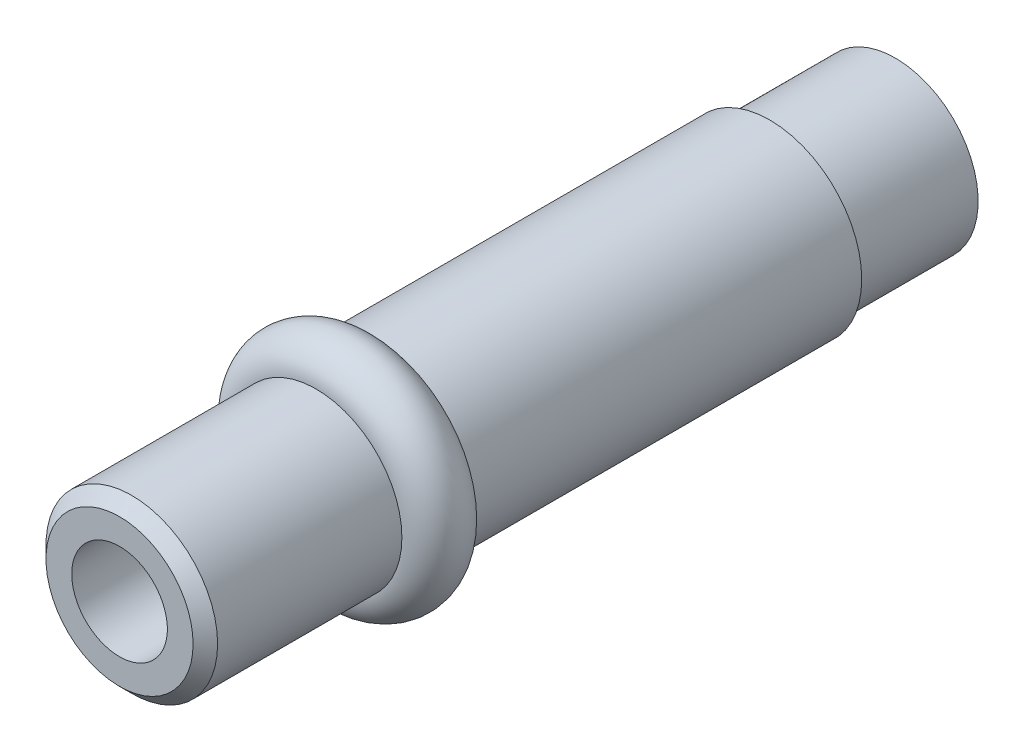
ISO-10303-21;
HEADER;
FILE_DESCRIPTION(('STEP AP214'),'2;1');
FILE_NAME('part.step','',(''),(''),'','','');
FILE_SCHEMA(('AUTOMOTIVE_DESIGN { 1 0 10303 214 1 1 1 1 }'));
ENDSEC;
DATA;
#1=APPLICATION_CONTEXT('core data for automotive mechanical design processes');
#2=APPLICATION_PROTOCOL_DEFINITION('international standard','automotive_design',2000,#1);
#3=PRODUCT_CONTEXT('',#1,'mechanical');
#4=PRODUCT('Part','Part','',(#3));
#5=PRODUCT_RELATED_PRODUCT_CATEGORY('part','',(#4));
#6=PRODUCT_DEFINITION_FORMATION('','',#4);
#7=PRODUCT_DEFINITION_CONTEXT('part definition',#1,'design');
#8=PRODUCT_DEFINITION('design','',#6,#7);
#9=PRODUCT_DEFINITION_SHAPE('','',#8);
#10=(LENGTH_UNIT() NAMED_UNIT(*) SI_UNIT(.MILLI.,.METRE.));
#11=(NAMED_UNIT(*) PLANE_ANGLE_UNIT() SI_UNIT($,.RADIAN.));
#12=(NAMED_UNIT(*) SI_UNIT($,.STERADIAN.) SOLID_ANGLE_UNIT());
#13=UNCERTAINTY_MEASURE_WITH_UNIT(LENGTH_MEASURE(1.E-05),#10,'distance_accuracy_value','');
#14=(GEOMETRIC_REPRESENTATION_CONTEXT(3) GLOBAL_UNCERTAINTY_ASSIGNED_CONTEXT((#13)) GLOBAL_UNIT_ASSIGNED_CONTEXT((#10,
#11,#12)) REPRESENTATION_CONTEXT('',''));
#15=CARTESIAN_POINT('',(0.,0.,0.));
#16=DIRECTION('',(0.,0.,1.));
#17=DIRECTION('',(1.,0.,0.));
#18=AXIS2_PLACEMENT_3D('',#15,#16,#17);
#19=CARTESIAN_POINT('',(0.,0.,32.1564));
#20=DIRECTION('',(0.,0.,-1.));
#21=DIRECTION('',(-1.,0.,0.));
#22=AXIS2_PLACEMENT_3D('',#19,#20,#21);
#23=CYLINDRICAL_SURFACE('',#22,3.81);
#24=CARTESIAN_POINT('',(0.,0.,21.452809000464));
#25=DIRECTION('',(0.,0.,1.));
#26=DIRECTION('',(1.,0.,0.));
#27=AXIS2_PLACEMENT_3D('',#24,#25,#26);
#28=CIRCLE('',#27,3.81);
#29=CARTESIAN_POINT('',(3.81,0.,21.452809000464));
#30=VERTEX_POINT('',#29);
#31=EDGE_CURVE('E63',#30,#30,#28,.T.);
#32=ORIENTED_EDGE('',*,*,#31,.F.);
#33=EDGE_LOOP('',(#32));
#34=FACE_BOUND('',#33,.T.);
#35=CARTESIAN_POINT('',(0.,0.,5.207));
#36=DIRECTION('',(0.,0.,-1.));
#37=DIRECTION('',(-1.,0.,0.));
#38=AXIS2_PLACEMENT_3D('',#35,#36,#37);
#39=CIRCLE('',#38,3.81);
#40=CARTESIAN_POINT('',(-3.81,0.,5.207));
#41=VERTEX_POINT('',#40);
#42=EDGE_CURVE('E54',#41,#41,#39,.T.);
#43=ORIENTED_EDGE('',*,*,#42,.F.);
#44=EDGE_LOOP('',(#43));
#45=FACE_BOUND('',#44,.T.);
#46=ADVANCED_FACE('F32',(#34,#45),#23,.T.);
#47=CARTESIAN_POINT('',(0.,0.,32.1564));
#48=DIRECTION('',(0.,0.,1.));
#49=DIRECTION('',(1.,0.,0.));
#50=AXIS2_PLACEMENT_3D('',#47,#48,#49);
#51=PLANE('',#50);
#52=CARTESIAN_POINT('',(0.,0.,32.1564));
#53=DIRECTION('',(0.,0.,1.));
#54=DIRECTION('',(1.,0.,0.));
#55=AXIS2_PLACEMENT_3D('',#52,#53,#54);
#56=CIRCLE('',#55,3.048);
#57=CARTESIAN_POINT('',(3.048,0.,32.1564));
#58=VERTEX_POINT('',#57);
#59=EDGE_CURVE('E40',#58,#58,#56,.T.);
#60=ORIENTED_EDGE('',*,*,#59,.T.);
#61=EDGE_LOOP('',(#60));
#62=FACE_BOUND('',#61,.T.);
#63=CARTESIAN_POINT('',(0.,0.,32.1564));
#64=DIRECTION('',(0.,0.,-1.));
#65=DIRECTION('',(-1.,0.,0.));
#66=AXIS2_PLACEMENT_3D('',#63,#64,#65);
#67=CIRCLE('',#66,1.9812);
#68=CARTESIAN_POINT('',(-1.9812,0.,32.1564));
#69=VERTEX_POINT('',#68);
#70=EDGE_CURVE('E48',#69,#69,#67,.T.);
#71=ORIENTED_EDGE('',*,*,#70,.T.);
#72=EDGE_LOOP('',(#71));
#73=FACE_BOUND('',#72,.T.);
#74=ADVANCED_FACE('F74',(#62,#73),#51,.T.);
#75=CARTESIAN_POINT('',(0.,0.,0.));
#76=DIRECTION('',(0.,0.,1.));
#77=DIRECTION('',(1.,0.,0.));
#78=AXIS2_PLACEMENT_3D('',#75,#76,#77);
#79=PLANE('',#78);
#80=CARTESIAN_POINT('',(0.,0.,0.));
#81=DIRECTION('',(0.,0.,-1.));
#82=DIRECTION('',(-1.,0.,0.));
#83=AXIS2_PLACEMENT_3D('',#80,#81,#82);
#84=CIRCLE('',#83,1.9812);
#85=CARTESIAN_POINT('',(-1.9812,0.,0.));
#86=VERTEX_POINT('',#85);
#87=EDGE_CURVE('E51',#86,#86,#84,.T.);
#88=ORIENTED_EDGE('',*,*,#87,.F.);
#89=EDGE_LOOP('',(#88));
#90=FACE_BOUND('',#89,.T.);
#91=CARTESIAN_POINT('',(0.,0.,0.));
#92=DIRECTION('',(0.,0.,-1.));
#93=DIRECTION('',(-1.,0.,0.));
#94=AXIS2_PLACEMENT_3D('',#91,#92,#93);
#95=CIRCLE('',#94,3.429);
#96=CARTESIAN_POINT('',(-3.429,0.,0.));
#97=VERTEX_POINT('',#96);
#98=EDGE_CURVE('E60',#97,#97,#95,.T.);
#99=ORIENTED_EDGE('',*,*,#98,.T.);
#100=EDGE_LOOP('',(#99));
#101=FACE_BOUND('',#100,.T.);
#102=ADVANCED_FACE('F90',(#90,#101),#79,.F.);
#103=CARTESIAN_POINT('',(0.,0.,32.1564));
#104=DIRECTION('',(0.,0.,-1.));
#105=DIRECTION('',(-1.,0.,0.));
#106=AXIS2_PLACEMENT_3D('',#103,#104,#105);
#107=CYLINDRICAL_SURFACE('',#106,1.9812);
#108=ORIENTED_EDGE('',*,*,#70,.F.);
#109=EDGE_LOOP('',(#108));
#110=FACE_BOUND('',#109,.T.);
#111=ORIENTED_EDGE('',*,*,#87,.T.);
#112=EDGE_LOOP('',(#111));
#113=FACE_BOUND('',#112,.T.);
#114=ADVANCED_FACE('F80',(#110,#113),#107,.F.);
#115=CARTESIAN_POINT('',(0.,0.,5.207));
#116=DIRECTION('',(0.,0.,-1.));
#117=DIRECTION('',(-1.,0.,0.));
#118=AXIS2_PLACEMENT_3D('',#115,#116,#117);
#119=PLANE('',#118);
#120=CARTESIAN_POINT('',(0.,0.,5.207));
#121=DIRECTION('',(0.,0.,-1.));
#122=DIRECTION('',(-1.,0.,0.));
#123=AXIS2_PLACEMENT_3D('',#120,#121,#122);
#124=CIRCLE('',#123,3.429);
#125=CARTESIAN_POINT('',(-3.429,0.,5.207));
#126=VERTEX_POINT('',#125);
#127=EDGE_CURVE('E59',#126,#126,#124,.T.);
#128=ORIENTED_EDGE('',*,*,#127,.F.);
#129=EDGE_LOOP('',(#128));
#130=FACE_BOUND('',#129,.T.);
#131=ORIENTED_EDGE('',*,*,#42,.T.);
#132=EDGE_LOOP('',(#131));
#133=FACE_BOUND('',#132,.T.);
#134=ADVANCED_FACE('F77',(#130,#133),#119,.T.);
#135=CARTESIAN_POINT('',(0.,0.,5.207));
#136=DIRECTION('',(0.,0.,-1.));
#137=DIRECTION('',(-1.,0.,0.));
#138=AXIS2_PLACEMENT_3D('',#135,#136,#137);
#139=CYLINDRICAL_SURFACE('',#138,3.429);
#140=ORIENTED_EDGE('',*,*,#127,.T.);
#141=EDGE_LOOP('',(#140));
#142=FACE_BOUND('',#141,.T.);
#143=ORIENTED_EDGE('',*,*,#98,.F.);
#144=EDGE_LOOP('',(#143));
#145=FACE_BOUND('',#144,.T.);
#146=ADVANCED_FACE('F79',(#142,#145),#139,.T.);
#147=CARTESIAN_POINT('',(0.,0.,22.5044));
#148=DIRECTION('',(0.,0.,1.));
#149=DIRECTION('',(1.,0.,0.));
#150=AXIS2_PLACEMENT_3D('',#147,#148,#149);
#151=CYLINDRICAL_SURFACE('',#150,3.556);
#152=CARTESIAN_POINT('',(0.,0.,31.6484));
#153=DIRECTION('',(0.,0.,1.));
#154=DIRECTION('',(1.,0.,0.));
#155=AXIS2_PLACEMENT_3D('',#152,#153,#154);
#156=CIRCLE('',#155,3.556);
#157=CARTESIAN_POINT('',(3.556,0.,31.6484));
#158=VERTEX_POINT('',#157);
#159=EDGE_CURVE('E10',#158,#158,#156,.F.);
#160=ORIENTED_EDGE('',*,*,#159,.T.);
#161=EDGE_LOOP('',(#160));
#162=FACE_BOUND('',#161,.T.);
#163=CARTESIAN_POINT('',(0.,0.,24.009676402776));
#164=DIRECTION('',(0.,0.,1.));
#165=DIRECTION('',(1.,0.,0.));
#166=AXIS2_PLACEMENT_3D('',#163,#164,#165);
#167=CIRCLE('',#166,3.556);
#168=CARTESIAN_POINT('',(3.556,0.,24.009676402776));
#169=VERTEX_POINT('',#168);
#170=EDGE_CURVE('E44',#169,#169,#167,.F.);
#171=ORIENTED_EDGE('',*,*,#170,.F.);
#172=EDGE_LOOP('',(#171));
#173=FACE_BOUND('',#172,.T.);
#174=ADVANCED_FACE('F87',(#162,#173),#151,.T.);
#175=CARTESIAN_POINT('',(0.,0.,22.7162809653479));
#176=DIRECTION('',(0.,0.,1.));
#177=DIRECTION('',(1.,0.,0.));
#178=AXIS2_PLACEMENT_3D('',#175,#176,#177);
#179=TOROIDAL_SURFACE('',#178,3.53238907182691,1.29361092817309);
#180=ORIENTED_EDGE('',*,*,#31,.T.);
#181=EDGE_LOOP('',(#180));
#182=FACE_BOUND('',#181,.T.);
#183=ORIENTED_EDGE('',*,*,#170,.T.);
#184=EDGE_LOOP('',(#183));
#185=FACE_BOUND('',#184,.T.);
#186=ADVANCED_FACE('F69',(#182,#185),#179,.T.);
#187=CARTESIAN_POINT('',(0.,0.,32.1564));
#188=DIRECTION('',(0.,0.,-1.));
#189=DIRECTION('',(-1.,0.,0.));
#190=AXIS2_PLACEMENT_3D('',#187,#188,#189);
#191=CONICAL_SURFACE('',#190,3.048,0.785398163397445);
#192=ORIENTED_EDGE('',*,*,#159,.F.);
#193=EDGE_LOOP('',(#192));
#194=FACE_BOUND('',#193,.T.);
#195=ORIENTED_EDGE('',*,*,#59,.F.);
#196=EDGE_LOOP('',(#195));
#197=FACE_BOUND('',#196,.T.);
#198=ADVANCED_FACE('F35',(#194,#197),#191,.T.);
#199=CLOSED_SHELL('',(#46,#74,#102,#114,#134,#146,#174,#186,#198));
#200=MANIFOLD_SOLID_BREP('B2',#199);
#201=ADVANCED_BREP_SHAPE_REPRESENTATION('',(#18,#200),#14);
#202=SHAPE_DEFINITION_REPRESENTATION(#9,#201);
ENDSEC;
END-ISO-10303-21;
